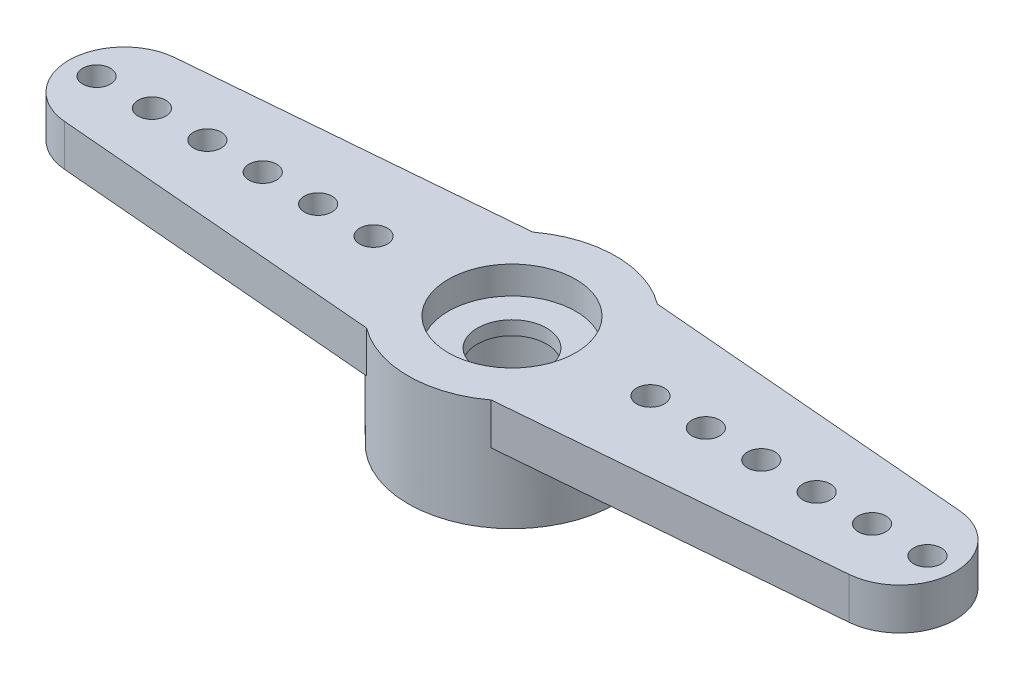
ISO-10303-21;
HEADER;
FILE_DESCRIPTION(('STEP AP214'),'2;1');
FILE_NAME('part.step','',(''),(''),'','','');
FILE_SCHEMA(('AUTOMOTIVE_DESIGN { 1 0 10303 214 1 1 1 1 }'));
ENDSEC;
DATA;
#1=APPLICATION_CONTEXT('core data for automotive mechanical design processes');
#2=APPLICATION_PROTOCOL_DEFINITION('international standard','automotive_design',2000,#1);
#3=PRODUCT_CONTEXT('',#1,'mechanical');
#4=PRODUCT('Part','Part','',(#3));
#5=PRODUCT_RELATED_PRODUCT_CATEGORY('part','',(#4));
#6=PRODUCT_DEFINITION_FORMATION('','',#4);
#7=PRODUCT_DEFINITION_CONTEXT('part definition',#1,'design');
#8=PRODUCT_DEFINITION('design','',#6,#7);
#9=PRODUCT_DEFINITION_SHAPE('','',#8);
#10=(LENGTH_UNIT() NAMED_UNIT(*) SI_UNIT(.MILLI.,.METRE.));
#11=(NAMED_UNIT(*) PLANE_ANGLE_UNIT() SI_UNIT($,.RADIAN.));
#12=(NAMED_UNIT(*) SI_UNIT($,.STERADIAN.) SOLID_ANGLE_UNIT());
#13=UNCERTAINTY_MEASURE_WITH_UNIT(LENGTH_MEASURE(1.E-05),#10,'distance_accuracy_value','');
#14=(GEOMETRIC_REPRESENTATION_CONTEXT(3) GLOBAL_UNCERTAINTY_ASSIGNED_CONTEXT((#13)) GLOBAL_UNIT_ASSIGNED_CONTEXT((#10,
#11,#12)) REPRESENTATION_CONTEXT('',''));
#15=CARTESIAN_POINT('',(0.,0.,0.));
#16=DIRECTION('',(0.,0.,1.));
#17=DIRECTION('',(1.,0.,0.));
#18=AXIS2_PLACEMENT_3D('',#15,#16,#17);
#19=CARTESIAN_POINT('',(0.,-1.5,0.));
#20=DIRECTION('',(0.,1.,0.));
#21=DIRECTION('',(0.,0.,1.));
#22=AXIS2_PLACEMENT_3D('',#19,#20,#21);
#23=CYLINDRICAL_SURFACE('',#22,1.25);
#24=CARTESIAN_POINT('',(0.,3.,0.));
#25=DIRECTION('',(0.,1.,0.));
#26=DIRECTION('',(0.,0.,1.));
#27=AXIS2_PLACEMENT_3D('',#24,#25,#26);
#28=CIRCLE('',#27,1.25);
#29=CARTESIAN_POINT('',(0.,3.,1.25));
#30=VERTEX_POINT('',#29);
#31=EDGE_CURVE('E510',#30,#30,#28,.T.);
#32=ORIENTED_EDGE('',*,*,#31,.T.);
#33=EDGE_LOOP('',(#32));
#34=FACE_BOUND('',#33,.T.);
#35=CARTESIAN_POINT('',(0.,2.5,0.));
#36=DIRECTION('',(0.,-1.,0.));
#37=DIRECTION('',(0.,0.,-1.));
#38=AXIS2_PLACEMENT_3D('',#35,#36,#37);
#39=CIRCLE('',#38,1.25);
#40=CARTESIAN_POINT('',(0.,2.5,-1.25));
#41=VERTEX_POINT('',#40);
#42=EDGE_CURVE('E36',#41,#41,#39,.F.);
#43=ORIENTED_EDGE('',*,*,#42,.F.);
#44=EDGE_LOOP('',(#43));
#45=FACE_BOUND('',#44,.T.);
#46=ADVANCED_FACE('F32',(#34,#45),#23,.F.);
#47=CARTESIAN_POINT('',(0.,4.,0.));
#48=DIRECTION('',(0.,-1.,0.));
#49=DIRECTION('',(0.,0.,-1.));
#50=AXIS2_PLACEMENT_3D('',#47,#48,#49);
#51=CYLINDRICAL_SURFACE('',#50,3.75);
#52=CARTESIAN_POINT('',(0.,4.,0.));
#53=DIRECTION('',(0.,1.,0.));
#54=DIRECTION('',(0.,0.,1.));
#55=AXIS2_PLACEMENT_3D('',#52,#53,#54);
#56=CIRCLE('',#55,3.75);
#57=CARTESIAN_POINT('',(2.25,4.,-3.));
#58=VERTEX_POINT('',#57);
#59=CARTESIAN_POINT('',(-2.25,4.,-3.));
#60=VERTEX_POINT('',#59);
#61=EDGE_CURVE('E41',#58,#60,#56,.T.);
#62=ORIENTED_EDGE('',*,*,#61,.F.);
#63=DIRECTION('',(0.,1.,0.));
#64=VECTOR('',#63,1.);
#65=CARTESIAN_POINT('',(2.25,2.5,-3.));
#66=LINE('',#65,#64);
#67=CARTESIAN_POINT('',(2.25,2.5,-3.));
#68=VERTEX_POINT('',#67);
#69=EDGE_CURVE('E124',#68,#58,#66,.T.);
#70=ORIENTED_EDGE('',*,*,#69,.F.);
#71=CARTESIAN_POINT('',(0.,2.5,0.));
#72=DIRECTION('',(0.,-1.,0.));
#73=DIRECTION('',(0.,0.,-1.));
#74=AXIS2_PLACEMENT_3D('',#71,#72,#73);
#75=CIRCLE('',#74,3.75);
#76=CARTESIAN_POINT('',(2.25,2.5,3.));
#77=VERTEX_POINT('',#76);
#78=EDGE_CURVE('E116',#68,#77,#75,.T.);
#79=ORIENTED_EDGE('',*,*,#78,.T.);
#80=DIRECTION('',(0.,1.,0.));
#81=VECTOR('',#80,1.);
#82=CARTESIAN_POINT('',(2.25,2.5,3.));
#83=LINE('',#82,#81);
#84=CARTESIAN_POINT('',(2.25,4.,3.));
#85=VERTEX_POINT('',#84);
#86=EDGE_CURVE('E100',#77,#85,#83,.T.);
#87=ORIENTED_EDGE('',*,*,#86,.T.);
#88=CARTESIAN_POINT('',(-2.25,4.,3.));
#89=VERTEX_POINT('',#88);
#90=EDGE_CURVE('E11',#89,#85,#56,.T.);
#91=ORIENTED_EDGE('',*,*,#90,.F.);
#92=DIRECTION('',(0.,1.,0.));
#93=VECTOR('',#92,1.);
#94=CARTESIAN_POINT('',(-2.25,2.5,3.));
#95=LINE('',#94,#93);
#96=CARTESIAN_POINT('',(-2.25,2.5,3.));
#97=VERTEX_POINT('',#96);
#98=EDGE_CURVE('E202',#97,#89,#95,.T.);
#99=ORIENTED_EDGE('',*,*,#98,.F.);
#100=CARTESIAN_POINT('',(0.,2.5,0.));
#101=DIRECTION('',(0.,-1.,0.));
#102=DIRECTION('',(0.,0.,1.));
#103=AXIS2_PLACEMENT_3D('',#100,#101,#102);
#104=CIRCLE('',#103,3.75);
#105=CARTESIAN_POINT('',(-2.25,2.5,-3.));
#106=VERTEX_POINT('',#105);
#107=EDGE_CURVE('E185',#97,#106,#104,.T.);
#108=ORIENTED_EDGE('',*,*,#107,.T.);
#109=DIRECTION('',(0.,1.,0.));
#110=VECTOR('',#109,1.);
#111=CARTESIAN_POINT('',(-2.25,2.5,-3.));
#112=LINE('',#111,#110);
#113=EDGE_CURVE('E199',#106,#60,#112,.T.);
#114=ORIENTED_EDGE('',*,*,#113,.T.);
#115=EDGE_LOOP('',(#62,#70,#79,#87,#91,#99,#108,#114));
#116=FACE_BOUND('',#115,.T.);
#117=CARTESIAN_POINT('',(0.,0.,0.));
#118=DIRECTION('',(0.,1.,0.));
#119=DIRECTION('',(0.,0.,1.));
#120=AXIS2_PLACEMENT_3D('',#117,#118,#119);
#121=CIRCLE('',#120,3.75);
#122=CARTESIAN_POINT('',(0.,0.,3.75));
#123=VERTEX_POINT('',#122);
#124=EDGE_CURVE('E208',#123,#123,#121,.T.);
#125=ORIENTED_EDGE('',*,*,#124,.T.);
#126=EDGE_LOOP('',(#125));
#127=FACE_BOUND('',#126,.T.);
#128=ADVANCED_FACE('F34',(#116,#127),#51,.T.);
#129=CARTESIAN_POINT('',(0.,4.,0.));
#130=DIRECTION('',(0.,1.,0.));
#131=DIRECTION('',(0.,0.,1.));
#132=AXIS2_PLACEMENT_3D('',#129,#130,#131);
#133=PLANE('',#132);
#134=CARTESIAN_POINT('',(0.,4.,0.));
#135=DIRECTION('',(0.,1.,0.));
#136=DIRECTION('',(0.,0.,1.));
#137=AXIS2_PLACEMENT_3D('',#134,#135,#136);
#138=CIRCLE('',#137,2.3);
#139=CARTESIAN_POINT('',(0.,4.,2.3));
#140=VERTEX_POINT('',#139);
#141=EDGE_CURVE('E198',#140,#140,#138,.T.);
#142=ORIENTED_EDGE('',*,*,#141,.F.);
#143=EDGE_LOOP('',(#142));
#144=FACE_BOUND('',#143,.T.);
#145=ORIENTED_EDGE('',*,*,#90,.T.);
#146=DIRECTION('',(0.996448898518601,0.,-0.0841997187707063));
#147=VECTOR('',#146,1.);
#148=CARTESIAN_POINT('',(14.1683994375414,4.,1.9928977970372));
#149=LINE('',#148,#147);
#150=CARTESIAN_POINT('',(14.1683994375414,4.,1.99289779703721));
#151=VERTEX_POINT('',#150);
#152=EDGE_CURVE('E105',#85,#151,#149,.T.);
#153=ORIENTED_EDGE('',*,*,#152,.T.);
#154=CARTESIAN_POINT('',(14.,4.,0.));
#155=DIRECTION('',(0.,1.,0.));
#156=DIRECTION('',(0.,0.,-1.));
#157=AXIS2_PLACEMENT_3D('',#154,#155,#156);
#158=CIRCLE('',#157,2.);
#159=CARTESIAN_POINT('',(14.1683994375414,4.,-1.9928977970372));
#160=VERTEX_POINT('',#159);
#161=EDGE_CURVE('E126',#151,#160,#158,.T.);
#162=ORIENTED_EDGE('',*,*,#161,.T.);
#163=DIRECTION('',(-0.996448898518601,0.,-0.0841997187707069));
#164=VECTOR('',#163,1.);
#165=CARTESIAN_POINT('',(14.1683994375414,4.,-1.9928977970372));
#166=LINE('',#165,#164);
#167=EDGE_CURVE('E49',#160,#58,#166,.T.);
#168=ORIENTED_EDGE('',*,*,#167,.T.);
#169=ORIENTED_EDGE('',*,*,#61,.T.);
#170=DIRECTION('',(-0.996448898518601,0.,0.0841997187707069));
#171=VECTOR('',#170,1.);
#172=CARTESIAN_POINT('',(-14.1683994375414,4.,-1.9928977970372));
#173=LINE('',#172,#171);
#174=CARTESIAN_POINT('',(-14.1683994375414,4.,-1.9928977970372));
#175=VERTEX_POINT('',#174);
#176=EDGE_CURVE('E182',#60,#175,#173,.T.);
#177=ORIENTED_EDGE('',*,*,#176,.T.);
#178=CARTESIAN_POINT('',(-14.,4.,0.));
#179=DIRECTION('',(0.,1.,0.));
#180=DIRECTION('',(0.,0.,1.));
#181=AXIS2_PLACEMENT_3D('',#178,#179,#180);
#182=CIRCLE('',#181,2.);
#183=CARTESIAN_POINT('',(-14.1683994375414,4.,1.9928977970372));
#184=VERTEX_POINT('',#183);
#185=EDGE_CURVE('E175',#175,#184,#182,.T.);
#186=ORIENTED_EDGE('',*,*,#185,.T.);
#187=DIRECTION('',(0.996448898518601,0.,0.0841997187707063));
#188=VECTOR('',#187,1.);
#189=CARTESIAN_POINT('',(-14.1683994375414,4.,1.9928977970372));
#190=LINE('',#189,#188);
#191=EDGE_CURVE('E55',#184,#89,#190,.T.);
#192=ORIENTED_EDGE('',*,*,#191,.T.);
#193=EDGE_LOOP('',(#145,#153,#162,#168,#169,#177,#186,#192));
#194=FACE_BOUND('',#193,.T.);
#195=CARTESIAN_POINT('',(-5.,4.,0.));
#196=DIRECTION('',(0.,1.,0.));
#197=DIRECTION('',(0.,0.,1.));
#198=AXIS2_PLACEMENT_3D('',#195,#196,#197);
#199=CIRCLE('',#198,0.500000000000001);
#200=CARTESIAN_POINT('',(-5.,4.,0.500000000000005));
#201=VERTEX_POINT('',#200);
#202=EDGE_CURVE('E138',#201,#201,#199,.T.);
#203=ORIENTED_EDGE('',*,*,#202,.F.);
#204=EDGE_LOOP('',(#203));
#205=FACE_BOUND('',#204,.T.);
#206=CARTESIAN_POINT('',(-7.,4.,0.));
#207=DIRECTION('',(0.,1.,0.));
#208=DIRECTION('',(0.,0.,1.));
#209=AXIS2_PLACEMENT_3D('',#206,#207,#208);
#210=CIRCLE('',#209,0.500000000000001);
#211=CARTESIAN_POINT('',(-7.,4.,0.500000000000005));
#212=VERTEX_POINT('',#211);
#213=EDGE_CURVE('E145',#212,#212,#210,.T.);
#214=ORIENTED_EDGE('',*,*,#213,.F.);
#215=EDGE_LOOP('',(#214));
#216=FACE_BOUND('',#215,.T.);
#217=CARTESIAN_POINT('',(-9.,4.,0.));
#218=DIRECTION('',(0.,1.,0.));
#219=DIRECTION('',(0.,0.,1.));
#220=AXIS2_PLACEMENT_3D('',#217,#218,#219);
#221=CIRCLE('',#220,0.500000000000001);
#222=CARTESIAN_POINT('',(-9.,4.,0.500000000000005));
#223=VERTEX_POINT('',#222);
#224=EDGE_CURVE('E151',#223,#223,#221,.T.);
#225=ORIENTED_EDGE('',*,*,#224,.F.);
#226=EDGE_LOOP('',(#225));
#227=FACE_BOUND('',#226,.T.);
#228=CARTESIAN_POINT('',(-11.,4.,0.));
#229=DIRECTION('',(0.,1.,0.));
#230=DIRECTION('',(0.,0.,1.));
#231=AXIS2_PLACEMENT_3D('',#228,#229,#230);
#232=CIRCLE('',#231,0.500000000000001);
#233=CARTESIAN_POINT('',(-11.,4.,0.500000000000005));
#234=VERTEX_POINT('',#233);
#235=EDGE_CURVE('E157',#234,#234,#232,.T.);
#236=ORIENTED_EDGE('',*,*,#235,.F.);
#237=EDGE_LOOP('',(#236));
#238=FACE_BOUND('',#237,.T.);
#239=CARTESIAN_POINT('',(-13.,4.,0.));
#240=DIRECTION('',(0.,1.,0.));
#241=DIRECTION('',(0.,0.,1.));
#242=AXIS2_PLACEMENT_3D('',#239,#240,#241);
#243=CIRCLE('',#242,0.500000000000001);
#244=CARTESIAN_POINT('',(-13.,4.,0.500000000000005));
#245=VERTEX_POINT('',#244);
#246=EDGE_CURVE('E163',#245,#245,#243,.T.);
#247=ORIENTED_EDGE('',*,*,#246,.F.);
#248=EDGE_LOOP('',(#247));
#249=FACE_BOUND('',#248,.T.);
#250=CARTESIAN_POINT('',(-15.,4.,0.));
#251=DIRECTION('',(0.,1.,0.));
#252=DIRECTION('',(0.,0.,1.));
#253=AXIS2_PLACEMENT_3D('',#250,#251,#252);
#254=CIRCLE('',#253,0.500000000000001);
#255=CARTESIAN_POINT('',(-15.,4.,0.500000000000005));
#256=VERTEX_POINT('',#255);
#257=EDGE_CURVE('E169',#256,#256,#254,.T.);
#258=ORIENTED_EDGE('',*,*,#257,.F.);
#259=EDGE_LOOP('',(#258));
#260=FACE_BOUND('',#259,.T.);
#261=CARTESIAN_POINT('',(13.,4.,0.));
#262=DIRECTION('',(0.,1.,0.));
#263=DIRECTION('',(0.,0.,-1.));
#264=AXIS2_PLACEMENT_3D('',#261,#262,#263);
#265=CIRCLE('',#264,0.500000000000001);
#266=CARTESIAN_POINT('',(13.,4.,-0.499999999999997));
#267=VERTEX_POINT('',#266);
#268=EDGE_CURVE('E512',#267,#267,#265,.T.);
#269=ORIENTED_EDGE('',*,*,#268,.F.);
#270=EDGE_LOOP('',(#269));
#271=FACE_BOUND('',#270,.T.);
#272=CARTESIAN_POINT('',(11.,4.,0.));
#273=DIRECTION('',(0.,1.,0.));
#274=DIRECTION('',(0.,0.,-1.));
#275=AXIS2_PLACEMENT_3D('',#272,#273,#274);
#276=CIRCLE('',#275,0.500000000000001);
#277=CARTESIAN_POINT('',(11.,4.,-0.499999999999997));
#278=VERTEX_POINT('',#277);
#279=EDGE_CURVE('E516',#278,#278,#276,.T.);
#280=ORIENTED_EDGE('',*,*,#279,.F.);
#281=EDGE_LOOP('',(#280));
#282=FACE_BOUND('',#281,.T.);
#283=CARTESIAN_POINT('',(9.,4.,0.));
#284=DIRECTION('',(0.,1.,0.));
#285=DIRECTION('',(0.,0.,-1.));
#286=AXIS2_PLACEMENT_3D('',#283,#284,#285);
#287=CIRCLE('',#286,0.500000000000001);
#288=CARTESIAN_POINT('',(9.,4.,-0.499999999999997));
#289=VERTEX_POINT('',#288);
#290=EDGE_CURVE('E522',#289,#289,#287,.T.);
#291=ORIENTED_EDGE('',*,*,#290,.F.);
#292=EDGE_LOOP('',(#291));
#293=FACE_BOUND('',#292,.T.);
#294=CARTESIAN_POINT('',(7.,4.,0.));
#295=DIRECTION('',(0.,1.,0.));
#296=DIRECTION('',(0.,0.,-1.));
#297=AXIS2_PLACEMENT_3D('',#294,#295,#296);
#298=CIRCLE('',#297,0.500000000000001);
#299=CARTESIAN_POINT('',(7.,4.,-0.499999999999997));
#300=VERTEX_POINT('',#299);
#301=EDGE_CURVE('E528',#300,#300,#298,.T.);
#302=ORIENTED_EDGE('',*,*,#301,.F.);
#303=EDGE_LOOP('',(#302));
#304=FACE_BOUND('',#303,.T.);
#305=CARTESIAN_POINT('',(5.,4.,0.));
#306=DIRECTION('',(0.,1.,0.));
#307=DIRECTION('',(0.,0.,-1.));
#308=AXIS2_PLACEMENT_3D('',#305,#306,#307);
#309=CIRCLE('',#308,0.500000000000001);
#310=CARTESIAN_POINT('',(5.,4.,-0.499999999999997));
#311=VERTEX_POINT('',#310);
#312=EDGE_CURVE('E534',#311,#311,#309,.T.);
#313=ORIENTED_EDGE('',*,*,#312,.F.);
#314=EDGE_LOOP('',(#313));
#315=FACE_BOUND('',#314,.T.);
#316=CARTESIAN_POINT('',(15.,4.,0.));
#317=DIRECTION('',(0.,1.,0.));
#318=DIRECTION('',(0.,0.,-1.));
#319=AXIS2_PLACEMENT_3D('',#316,#317,#318);
#320=CIRCLE('',#319,0.500000000000001);
#321=CARTESIAN_POINT('',(15.,4.,-0.499999999999997));
#322=VERTEX_POINT('',#321);
#323=EDGE_CURVE('E129',#322,#322,#320,.T.);
#324=ORIENTED_EDGE('',*,*,#323,.F.);
#325=EDGE_LOOP('',(#324));
#326=FACE_BOUND('',#325,.T.);
#327=ADVANCED_FACE('F213',(#144,#194,#205,#216,#227,#238,#249,#260,#271,#282,#293,#304,#315,
#326),#133,.T.);
#328=CARTESIAN_POINT('',(0.,0.,0.));
#329=DIRECTION('',(0.,1.,0.));
#330=DIRECTION('',(0.,0.,1.));
#331=AXIS2_PLACEMENT_3D('',#328,#329,#330);
#332=PLANE('',#331);
#333=CARTESIAN_POINT('',(0.,0.,0.));
#334=DIRECTION('',(0.,-1.,0.));
#335=DIRECTION('',(0.,0.,-1.));
#336=AXIS2_PLACEMENT_3D('',#333,#334,#335);
#337=CIRCLE('',#336,2.3);
#338=CARTESIAN_POINT('',(0.,0.,-2.3));
#339=VERTEX_POINT('',#338);
#340=EDGE_CURVE('E503',#339,#339,#337,.T.);
#341=ORIENTED_EDGE('',*,*,#340,.F.);
#342=EDGE_LOOP('',(#341));
#343=FACE_BOUND('',#342,.T.);
#344=ORIENTED_EDGE('',*,*,#124,.F.);
#345=EDGE_LOOP('',(#344));
#346=FACE_BOUND('',#345,.T.);
#347=ADVANCED_FACE('F463',(#343,#346),#332,.F.);
#348=CARTESIAN_POINT('',(0.,3.,0.));
#349=DIRECTION('',(0.,1.,0.));
#350=DIRECTION('',(0.,0.,1.));
#351=AXIS2_PLACEMENT_3D('',#348,#349,#350);
#352=CYLINDRICAL_SURFACE('',#351,2.3);
#353=CARTESIAN_POINT('',(0.,3.,0.));
#354=DIRECTION('',(0.,1.,0.));
#355=DIRECTION('',(0.,0.,1.));
#356=AXIS2_PLACEMENT_3D('',#353,#354,#355);
#357=CIRCLE('',#356,2.3);
#358=CARTESIAN_POINT('',(0.,3.,2.3));
#359=VERTEX_POINT('',#358);
#360=EDGE_CURVE('E205',#359,#359,#357,.T.);
#361=ORIENTED_EDGE('',*,*,#360,.F.);
#362=EDGE_LOOP('',(#361));
#363=FACE_BOUND('',#362,.T.);
#364=ORIENTED_EDGE('',*,*,#141,.T.);
#365=EDGE_LOOP('',(#364));
#366=FACE_BOUND('',#365,.T.);
#367=ADVANCED_FACE('F236',(#363,#366),#352,.F.);
#368=CARTESIAN_POINT('',(0.,3.,0.));
#369=DIRECTION('',(0.,1.,0.));
#370=DIRECTION('',(0.,0.,1.));
#371=AXIS2_PLACEMENT_3D('',#368,#369,#370);
#372=PLANE('',#371);
#373=ORIENTED_EDGE('',*,*,#31,.F.);
#374=EDGE_LOOP('',(#373));
#375=FACE_BOUND('',#374,.T.);
#376=ORIENTED_EDGE('',*,*,#360,.T.);
#377=EDGE_LOOP('',(#376));
#378=FACE_BOUND('',#377,.T.);
#379=ADVANCED_FACE('F229',(#375,#378),#372,.T.);
#380=CARTESIAN_POINT('',(-14.,2.5,0.));
#381=DIRECTION('',(0.,1.,0.));
#382=DIRECTION('',(0.,0.,1.));
#383=AXIS2_PLACEMENT_3D('',#380,#381,#382);
#384=CYLINDRICAL_SURFACE('',#383,2.);
#385=ORIENTED_EDGE('',*,*,#185,.F.);
#386=DIRECTION('',(0.,1.,0.));
#387=VECTOR('',#386,1.);
#388=CARTESIAN_POINT('',(-14.1683994375414,2.5,-1.9928977970372));
#389=LINE('',#388,#387);
#390=CARTESIAN_POINT('',(-14.1683994375414,2.5,-1.9928977970372));
#391=VERTEX_POINT('',#390);
#392=EDGE_CURVE('E196',#391,#175,#389,.T.);
#393=ORIENTED_EDGE('',*,*,#392,.F.);
#394=CARTESIAN_POINT('',(-14.,2.5,0.));
#395=DIRECTION('',(0.,1.,0.));
#396=DIRECTION('',(0.,0.,1.));
#397=AXIS2_PLACEMENT_3D('',#394,#395,#396);
#398=CIRCLE('',#397,2.);
#399=CARTESIAN_POINT('',(-14.1683994375414,2.5,1.9928977970372));
#400=VERTEX_POINT('',#399);
#401=EDGE_CURVE('E178',#391,#400,#398,.T.);
#402=ORIENTED_EDGE('',*,*,#401,.T.);
#403=DIRECTION('',(0.,1.,0.));
#404=VECTOR('',#403,1.);
#405=CARTESIAN_POINT('',(-14.1683994375414,2.5,1.9928977970372));
#406=LINE('',#405,#404);
#407=EDGE_CURVE('E191',#400,#184,#406,.T.);
#408=ORIENTED_EDGE('',*,*,#407,.T.);
#409=EDGE_LOOP('',(#385,#393,#402,#408));
#410=FACE_BOUND('',#409,.T.);
#411=ADVANCED_FACE('F227',(#410),#384,.T.);
#412=CARTESIAN_POINT('',(-14.1683994375414,2.5,-1.9928977970372));
#413=DIRECTION('',(-0.0841997187707069,0.,-0.996448898518601));
#414=DIRECTION('',(-0.996448898518601,0.,0.0841997187707069));
#415=AXIS2_PLACEMENT_3D('',#412,#413,#414);
#416=PLANE('',#415);
#417=ORIENTED_EDGE('',*,*,#176,.F.);
#418=ORIENTED_EDGE('',*,*,#113,.F.);
#419=DIRECTION('',(-0.996448898518601,0.,0.0841997187707069));
#420=VECTOR('',#419,1.);
#421=CARTESIAN_POINT('',(-14.1683994375414,2.5,-1.9928977970372));
#422=LINE('',#421,#420);
#423=EDGE_CURVE('E188',#106,#391,#422,.T.);
#424=ORIENTED_EDGE('',*,*,#423,.T.);
#425=ORIENTED_EDGE('',*,*,#392,.T.);
#426=EDGE_LOOP('',(#417,#418,#424,#425));
#427=FACE_BOUND('',#426,.T.);
#428=ADVANCED_FACE('F216',(#427),#416,.T.);
#429=CARTESIAN_POINT('',(-14.1683994375414,2.5,1.9928977970372));
#430=DIRECTION('',(-0.0841997187707063,0.,0.996448898518601));
#431=DIRECTION('',(0.996448898518601,0.,0.0841997187707063));
#432=AXIS2_PLACEMENT_3D('',#429,#430,#431);
#433=PLANE('',#432);
#434=ORIENTED_EDGE('',*,*,#191,.F.);
#435=ORIENTED_EDGE('',*,*,#407,.F.);
#436=DIRECTION('',(0.996448898518601,0.,0.0841997187707063));
#437=VECTOR('',#436,1.);
#438=CARTESIAN_POINT('',(-14.1683994375414,2.5,1.9928977970372));
#439=LINE('',#438,#437);
#440=EDGE_CURVE('E181',#400,#97,#439,.T.);
#441=ORIENTED_EDGE('',*,*,#440,.T.);
#442=ORIENTED_EDGE('',*,*,#98,.T.);
#443=EDGE_LOOP('',(#434,#435,#441,#442));
#444=FACE_BOUND('',#443,.T.);
#445=ADVANCED_FACE('F225',(#444),#433,.T.);
#446=CARTESIAN_POINT('',(-14.,2.5,0.));
#447=DIRECTION('',(0.,1.,0.));
#448=DIRECTION('',(0.,0.,1.));
#449=AXIS2_PLACEMENT_3D('',#446,#447,#448);
#450=PLANE('',#449);
#451=CARTESIAN_POINT('',(-5.,2.5,0.));
#452=DIRECTION('',(0.,1.,0.));
#453=DIRECTION('',(0.,0.,1.));
#454=AXIS2_PLACEMENT_3D('',#451,#452,#453);
#455=CIRCLE('',#454,0.500000000000001);
#456=CARTESIAN_POINT('',(-5.,2.5,0.500000000000005));
#457=VERTEX_POINT('',#456);
#458=EDGE_CURVE('E142',#457,#457,#455,.T.);
#459=ORIENTED_EDGE('',*,*,#458,.T.);
#460=EDGE_LOOP('',(#459));
#461=FACE_BOUND('',#460,.T.);
#462=CARTESIAN_POINT('',(-7.,2.5,0.));
#463=DIRECTION('',(0.,1.,0.));
#464=DIRECTION('',(0.,0.,1.));
#465=AXIS2_PLACEMENT_3D('',#462,#463,#464);
#466=CIRCLE('',#465,0.500000000000001);
#467=CARTESIAN_POINT('',(-7.,2.5,0.500000000000005));
#468=VERTEX_POINT('',#467);
#469=EDGE_CURVE('E148',#468,#468,#466,.T.);
#470=ORIENTED_EDGE('',*,*,#469,.T.);
#471=EDGE_LOOP('',(#470));
#472=FACE_BOUND('',#471,.T.);
#473=CARTESIAN_POINT('',(-9.,2.5,0.));
#474=DIRECTION('',(0.,1.,0.));
#475=DIRECTION('',(0.,0.,1.));
#476=AXIS2_PLACEMENT_3D('',#473,#474,#475);
#477=CIRCLE('',#476,0.500000000000001);
#478=CARTESIAN_POINT('',(-9.,2.5,0.500000000000005));
#479=VERTEX_POINT('',#478);
#480=EDGE_CURVE('E154',#479,#479,#477,.T.);
#481=ORIENTED_EDGE('',*,*,#480,.T.);
#482=EDGE_LOOP('',(#481));
#483=FACE_BOUND('',#482,.T.);
#484=CARTESIAN_POINT('',(-11.,2.5,0.));
#485=DIRECTION('',(0.,1.,0.));
#486=DIRECTION('',(0.,0.,1.));
#487=AXIS2_PLACEMENT_3D('',#484,#485,#486);
#488=CIRCLE('',#487,0.500000000000001);
#489=CARTESIAN_POINT('',(-11.,2.5,0.500000000000005));
#490=VERTEX_POINT('',#489);
#491=EDGE_CURVE('E160',#490,#490,#488,.T.);
#492=ORIENTED_EDGE('',*,*,#491,.T.);
#493=EDGE_LOOP('',(#492));
#494=FACE_BOUND('',#493,.T.);
#495=CARTESIAN_POINT('',(-13.,2.5,0.));
#496=DIRECTION('',(0.,1.,0.));
#497=DIRECTION('',(0.,0.,1.));
#498=AXIS2_PLACEMENT_3D('',#495,#496,#497);
#499=CIRCLE('',#498,0.500000000000001);
#500=CARTESIAN_POINT('',(-13.,2.5,0.500000000000005));
#501=VERTEX_POINT('',#500);
#502=EDGE_CURVE('E166',#501,#501,#499,.T.);
#503=ORIENTED_EDGE('',*,*,#502,.T.);
#504=EDGE_LOOP('',(#503));
#505=FACE_BOUND('',#504,.T.);
#506=CARTESIAN_POINT('',(-15.,2.5,0.));
#507=DIRECTION('',(0.,1.,0.));
#508=DIRECTION('',(0.,0.,1.));
#509=AXIS2_PLACEMENT_3D('',#506,#507,#508);
#510=CIRCLE('',#509,0.500000000000001);
#511=CARTESIAN_POINT('',(-15.,2.5,0.500000000000005));
#512=VERTEX_POINT('',#511);
#513=EDGE_CURVE('E172',#512,#512,#510,.T.);
#514=ORIENTED_EDGE('',*,*,#513,.T.);
#515=EDGE_LOOP('',(#514));
#516=FACE_BOUND('',#515,.T.);
#517=ORIENTED_EDGE('',*,*,#401,.F.);
#518=ORIENTED_EDGE('',*,*,#423,.F.);
#519=ORIENTED_EDGE('',*,*,#107,.F.);
#520=ORIENTED_EDGE('',*,*,#440,.F.);
#521=EDGE_LOOP('',(#517,#518,#519,#520));
#522=FACE_BOUND('',#521,.T.);
#523=ADVANCED_FACE('F223',(#461,#472,#483,#494,#505,#516,#522),#450,.F.);
#524=CARTESIAN_POINT('',(-15.,2.5,0.));
#525=DIRECTION('',(0.,1.,0.));
#526=DIRECTION('',(0.,0.,1.));
#527=AXIS2_PLACEMENT_3D('',#524,#525,#526);
#528=CYLINDRICAL_SURFACE('',#527,0.500000000000001);
#529=ORIENTED_EDGE('',*,*,#513,.F.);
#530=EDGE_LOOP('',(#529));
#531=FACE_BOUND('',#530,.T.);
#532=ORIENTED_EDGE('',*,*,#257,.T.);
#533=EDGE_LOOP('',(#532));
#534=FACE_BOUND('',#533,.T.);
#535=ADVANCED_FACE('F309',(#531,#534),#528,.F.);
#536=CARTESIAN_POINT('',(-13.,2.5,0.));
#537=DIRECTION('',(0.,1.,0.));
#538=DIRECTION('',(0.,0.,1.));
#539=AXIS2_PLACEMENT_3D('',#536,#537,#538);
#540=CYLINDRICAL_SURFACE('',#539,0.500000000000001);
#541=ORIENTED_EDGE('',*,*,#502,.F.);
#542=EDGE_LOOP('',(#541));
#543=FACE_BOUND('',#542,.T.);
#544=ORIENTED_EDGE('',*,*,#246,.T.);
#545=EDGE_LOOP('',(#544));
#546=FACE_BOUND('',#545,.T.);
#547=ADVANCED_FACE('F305',(#543,#546),#540,.F.);
#548=CARTESIAN_POINT('',(-11.,2.5,0.));
#549=DIRECTION('',(0.,1.,0.));
#550=DIRECTION('',(0.,0.,1.));
#551=AXIS2_PLACEMENT_3D('',#548,#549,#550);
#552=CYLINDRICAL_SURFACE('',#551,0.500000000000001);
#553=ORIENTED_EDGE('',*,*,#491,.F.);
#554=EDGE_LOOP('',(#553));
#555=FACE_BOUND('',#554,.T.);
#556=ORIENTED_EDGE('',*,*,#235,.T.);
#557=EDGE_LOOP('',(#556));
#558=FACE_BOUND('',#557,.T.);
#559=ADVANCED_FACE('F301',(#555,#558),#552,.F.);
#560=CARTESIAN_POINT('',(-9.,2.5,0.));
#561=DIRECTION('',(0.,1.,0.));
#562=DIRECTION('',(0.,0.,1.));
#563=AXIS2_PLACEMENT_3D('',#560,#561,#562);
#564=CYLINDRICAL_SURFACE('',#563,0.500000000000001);
#565=ORIENTED_EDGE('',*,*,#480,.F.);
#566=EDGE_LOOP('',(#565));
#567=FACE_BOUND('',#566,.T.);
#568=ORIENTED_EDGE('',*,*,#224,.T.);
#569=EDGE_LOOP('',(#568));
#570=FACE_BOUND('',#569,.T.);
#571=ADVANCED_FACE('F297',(#567,#570),#564,.F.);
#572=CARTESIAN_POINT('',(-7.,2.5,0.));
#573=DIRECTION('',(0.,1.,0.));
#574=DIRECTION('',(0.,0.,1.));
#575=AXIS2_PLACEMENT_3D('',#572,#573,#574);
#576=CYLINDRICAL_SURFACE('',#575,0.500000000000001);
#577=ORIENTED_EDGE('',*,*,#469,.F.);
#578=EDGE_LOOP('',(#577));
#579=FACE_BOUND('',#578,.T.);
#580=ORIENTED_EDGE('',*,*,#213,.T.);
#581=EDGE_LOOP('',(#580));
#582=FACE_BOUND('',#581,.T.);
#583=ADVANCED_FACE('F293',(#579,#582),#576,.F.);
#584=CARTESIAN_POINT('',(-5.,2.5,0.));
#585=DIRECTION('',(0.,1.,0.));
#586=DIRECTION('',(0.,0.,1.));
#587=AXIS2_PLACEMENT_3D('',#584,#585,#586);
#588=CYLINDRICAL_SURFACE('',#587,0.500000000000001);
#589=ORIENTED_EDGE('',*,*,#458,.F.);
#590=EDGE_LOOP('',(#589));
#591=FACE_BOUND('',#590,.T.);
#592=ORIENTED_EDGE('',*,*,#202,.T.);
#593=EDGE_LOOP('',(#592));
#594=FACE_BOUND('',#593,.T.);
#595=ADVANCED_FACE('F284',(#591,#594),#588,.F.);
#596=CARTESIAN_POINT('',(14.1683994375414,2.5,-1.9928977970372));
#597=DIRECTION('',(0.0841997187707069,0.,-0.996448898518601));
#598=DIRECTION('',(-0.996448898518601,0.,-0.0841997187707069));
#599=AXIS2_PLACEMENT_3D('',#596,#597,#598);
#600=PLANE('',#599);
#601=ORIENTED_EDGE('',*,*,#167,.F.);
#602=DIRECTION('',(0.,1.,0.));
#603=VECTOR('',#602,1.);
#604=CARTESIAN_POINT('',(14.1683994375414,2.5,-1.9928977970372));
#605=LINE('',#604,#603);
#606=CARTESIAN_POINT('',(14.1683994375414,2.5,-1.9928977970372));
#607=VERTEX_POINT('',#606);
#608=EDGE_CURVE('E139',#607,#160,#605,.T.);
#609=ORIENTED_EDGE('',*,*,#608,.F.);
#610=DIRECTION('',(-0.996448898518601,0.,-0.0841997187707069));
#611=VECTOR('',#610,1.);
#612=CARTESIAN_POINT('',(14.1683994375414,2.5,-1.9928977970372));
#613=LINE('',#612,#611);
#614=EDGE_CURVE('E110',#607,#68,#613,.T.);
#615=ORIENTED_EDGE('',*,*,#614,.T.);
#616=ORIENTED_EDGE('',*,*,#69,.T.);
#617=EDGE_LOOP('',(#601,#609,#615,#616));
#618=FACE_BOUND('',#617,.T.);
#619=ADVANCED_FACE('F280',(#618),#600,.T.);
#620=CARTESIAN_POINT('',(14.,2.5,0.));
#621=DIRECTION('',(0.,1.,0.));
#622=DIRECTION('',(0.,0.,1.));
#623=AXIS2_PLACEMENT_3D('',#620,#621,#622);
#624=CYLINDRICAL_SURFACE('',#623,2.);
#625=ORIENTED_EDGE('',*,*,#161,.F.);
#626=DIRECTION('',(0.,1.,0.));
#627=VECTOR('',#626,1.);
#628=CARTESIAN_POINT('',(14.1683994375414,2.5,1.99289779703721));
#629=LINE('',#628,#627);
#630=CARTESIAN_POINT('',(14.1683994375414,2.5,1.99289779703721));
#631=VERTEX_POINT('',#630);
#632=EDGE_CURVE('E109',#631,#151,#629,.T.);
#633=ORIENTED_EDGE('',*,*,#632,.F.);
#634=CARTESIAN_POINT('',(14.,2.5,0.));
#635=DIRECTION('',(0.,1.,0.));
#636=DIRECTION('',(0.,0.,-1.));
#637=AXIS2_PLACEMENT_3D('',#634,#635,#636);
#638=CIRCLE('',#637,2.);
#639=EDGE_CURVE('E119',#631,#607,#638,.T.);
#640=ORIENTED_EDGE('',*,*,#639,.T.);
#641=ORIENTED_EDGE('',*,*,#608,.T.);
#642=EDGE_LOOP('',(#625,#633,#640,#641));
#643=FACE_BOUND('',#642,.T.);
#644=ADVANCED_FACE('F283',(#643),#624,.T.);
#645=CARTESIAN_POINT('',(14.1683994375414,2.5,1.9928977970372));
#646=DIRECTION('',(0.0841997187707063,0.,0.996448898518601));
#647=DIRECTION('',(0.996448898518601,0.,-0.0841997187707063));
#648=AXIS2_PLACEMENT_3D('',#645,#646,#647);
#649=PLANE('',#648);
#650=ORIENTED_EDGE('',*,*,#152,.F.);
#651=ORIENTED_EDGE('',*,*,#86,.F.);
#652=DIRECTION('',(0.996448898518601,0.,-0.0841997187707063));
#653=VECTOR('',#652,1.);
#654=CARTESIAN_POINT('',(14.1683994375414,2.5,1.9928977970372));
#655=LINE('',#654,#653);
#656=EDGE_CURVE('E103',#77,#631,#655,.T.);
#657=ORIENTED_EDGE('',*,*,#656,.T.);
#658=ORIENTED_EDGE('',*,*,#632,.T.);
#659=EDGE_LOOP('',(#650,#651,#657,#658));
#660=FACE_BOUND('',#659,.T.);
#661=ADVANCED_FACE('F102',(#660),#649,.T.);
#662=CARTESIAN_POINT('',(0.,2.5,0.));
#663=DIRECTION('',(0.,-1.,0.));
#664=DIRECTION('',(0.,0.,-1.));
#665=AXIS2_PLACEMENT_3D('',#662,#663,#664);
#666=PLANE('',#665);
#667=CARTESIAN_POINT('',(13.,2.5,0.));
#668=DIRECTION('',(0.,1.,0.));
#669=DIRECTION('',(0.,0.,-1.));
#670=AXIS2_PLACEMENT_3D('',#667,#668,#669);
#671=CIRCLE('',#670,0.500000000000001);
#672=CARTESIAN_POINT('',(13.,2.5,-0.499999999999997));
#673=VERTEX_POINT('',#672);
#674=EDGE_CURVE('E513',#673,#673,#671,.T.);
#675=ORIENTED_EDGE('',*,*,#674,.T.);
#676=EDGE_LOOP('',(#675));
#677=FACE_BOUND('',#676,.T.);
#678=CARTESIAN_POINT('',(11.,2.5,0.));
#679=DIRECTION('',(0.,1.,0.));
#680=DIRECTION('',(0.,0.,-1.));
#681=AXIS2_PLACEMENT_3D('',#678,#679,#680);
#682=CIRCLE('',#681,0.500000000000001);
#683=CARTESIAN_POINT('',(11.,2.5,-0.499999999999997));
#684=VERTEX_POINT('',#683);
#685=EDGE_CURVE('E519',#684,#684,#682,.T.);
#686=ORIENTED_EDGE('',*,*,#685,.T.);
#687=EDGE_LOOP('',(#686));
#688=FACE_BOUND('',#687,.T.);
#689=CARTESIAN_POINT('',(9.,2.5,0.));
#690=DIRECTION('',(0.,1.,0.));
#691=DIRECTION('',(0.,0.,-1.));
#692=AXIS2_PLACEMENT_3D('',#689,#690,#691);
#693=CIRCLE('',#692,0.500000000000001);
#694=CARTESIAN_POINT('',(9.,2.5,-0.499999999999997));
#695=VERTEX_POINT('',#694);
#696=EDGE_CURVE('E525',#695,#695,#693,.T.);
#697=ORIENTED_EDGE('',*,*,#696,.T.);
#698=EDGE_LOOP('',(#697));
#699=FACE_BOUND('',#698,.T.);
#700=CARTESIAN_POINT('',(7.,2.5,0.));
#701=DIRECTION('',(0.,1.,0.));
#702=DIRECTION('',(0.,0.,-1.));
#703=AXIS2_PLACEMENT_3D('',#700,#701,#702);
#704=CIRCLE('',#703,0.500000000000001);
#705=CARTESIAN_POINT('',(7.,2.5,-0.499999999999997));
#706=VERTEX_POINT('',#705);
#707=EDGE_CURVE('E531',#706,#706,#704,.T.);
#708=ORIENTED_EDGE('',*,*,#707,.T.);
#709=EDGE_LOOP('',(#708));
#710=FACE_BOUND('',#709,.T.);
#711=CARTESIAN_POINT('',(5.,2.5,0.));
#712=DIRECTION('',(0.,1.,0.));
#713=DIRECTION('',(0.,0.,-1.));
#714=AXIS2_PLACEMENT_3D('',#711,#712,#713);
#715=CIRCLE('',#714,0.500000000000001);
#716=CARTESIAN_POINT('',(5.,2.5,-0.499999999999997));
#717=VERTEX_POINT('',#716);
#718=EDGE_CURVE('E537',#717,#717,#715,.T.);
#719=ORIENTED_EDGE('',*,*,#718,.T.);
#720=EDGE_LOOP('',(#719));
#721=FACE_BOUND('',#720,.T.);
#722=CARTESIAN_POINT('',(15.,2.5,0.));
#723=DIRECTION('',(0.,1.,0.));
#724=DIRECTION('',(0.,0.,-1.));
#725=AXIS2_PLACEMENT_3D('',#722,#723,#724);
#726=CIRCLE('',#725,0.500000000000001);
#727=CARTESIAN_POINT('',(15.,2.5,-0.499999999999997));
#728=VERTEX_POINT('',#727);
#729=EDGE_CURVE('E135',#728,#728,#726,.T.);
#730=ORIENTED_EDGE('',*,*,#729,.T.);
#731=EDGE_LOOP('',(#730));
#732=FACE_BOUND('',#731,.T.);
#733=ORIENTED_EDGE('',*,*,#78,.F.);
#734=ORIENTED_EDGE('',*,*,#614,.F.);
#735=ORIENTED_EDGE('',*,*,#639,.F.);
#736=ORIENTED_EDGE('',*,*,#656,.F.);
#737=EDGE_LOOP('',(#733,#734,#735,#736));
#738=FACE_BOUND('',#737,.T.);
#739=ADVANCED_FACE('F114',(#677,#688,#699,#710,#721,#732,#738),#666,.T.);
#740=CARTESIAN_POINT('',(15.,2.5,0.));
#741=DIRECTION('',(0.,1.,0.));
#742=DIRECTION('',(0.,0.,1.));
#743=AXIS2_PLACEMENT_3D('',#740,#741,#742);
#744=CYLINDRICAL_SURFACE('',#743,0.500000000000001);
#745=ORIENTED_EDGE('',*,*,#729,.F.);
#746=EDGE_LOOP('',(#745));
#747=FACE_BOUND('',#746,.T.);
#748=ORIENTED_EDGE('',*,*,#323,.T.);
#749=EDGE_LOOP('',(#748));
#750=FACE_BOUND('',#749,.T.);
#751=ADVANCED_FACE('F272',(#747,#750),#744,.F.);
#752=CARTESIAN_POINT('',(5.,2.5,0.));
#753=DIRECTION('',(0.,1.,0.));
#754=DIRECTION('',(0.,0.,1.));
#755=AXIS2_PLACEMENT_3D('',#752,#753,#754);
#756=CYLINDRICAL_SURFACE('',#755,0.500000000000001);
#757=ORIENTED_EDGE('',*,*,#718,.F.);
#758=EDGE_LOOP('',(#757));
#759=FACE_BOUND('',#758,.T.);
#760=ORIENTED_EDGE('',*,*,#312,.T.);
#761=EDGE_LOOP('',(#760));
#762=FACE_BOUND('',#761,.T.);
#763=ADVANCED_FACE('F268',(#759,#762),#756,.F.);
#764=CARTESIAN_POINT('',(7.,2.5,0.));
#765=DIRECTION('',(0.,1.,0.));
#766=DIRECTION('',(0.,0.,1.));
#767=AXIS2_PLACEMENT_3D('',#764,#765,#766);
#768=CYLINDRICAL_SURFACE('',#767,0.500000000000001);
#769=ORIENTED_EDGE('',*,*,#707,.F.);
#770=EDGE_LOOP('',(#769));
#771=FACE_BOUND('',#770,.T.);
#772=ORIENTED_EDGE('',*,*,#301,.T.);
#773=EDGE_LOOP('',(#772));
#774=FACE_BOUND('',#773,.T.);
#775=ADVANCED_FACE('F264',(#771,#774),#768,.F.);
#776=CARTESIAN_POINT('',(9.,2.5,0.));
#777=DIRECTION('',(0.,1.,0.));
#778=DIRECTION('',(0.,0.,1.));
#779=AXIS2_PLACEMENT_3D('',#776,#777,#778);
#780=CYLINDRICAL_SURFACE('',#779,0.500000000000001);
#781=ORIENTED_EDGE('',*,*,#696,.F.);
#782=EDGE_LOOP('',(#781));
#783=FACE_BOUND('',#782,.T.);
#784=ORIENTED_EDGE('',*,*,#290,.T.);
#785=EDGE_LOOP('',(#784));
#786=FACE_BOUND('',#785,.T.);
#787=ADVANCED_FACE('F260',(#783,#786),#780,.F.);
#788=CARTESIAN_POINT('',(11.,2.5,0.));
#789=DIRECTION('',(0.,1.,0.));
#790=DIRECTION('',(0.,0.,1.));
#791=AXIS2_PLACEMENT_3D('',#788,#789,#790);
#792=CYLINDRICAL_SURFACE('',#791,0.500000000000001);
#793=ORIENTED_EDGE('',*,*,#685,.F.);
#794=EDGE_LOOP('',(#793));
#795=FACE_BOUND('',#794,.T.);
#796=ORIENTED_EDGE('',*,*,#279,.T.);
#797=EDGE_LOOP('',(#796));
#798=FACE_BOUND('',#797,.T.);
#799=ADVANCED_FACE('F256',(#795,#798),#792,.F.);
#800=CARTESIAN_POINT('',(13.,2.5,0.));
#801=DIRECTION('',(0.,1.,0.));
#802=DIRECTION('',(0.,0.,1.));
#803=AXIS2_PLACEMENT_3D('',#800,#801,#802);
#804=CYLINDRICAL_SURFACE('',#803,0.500000000000001);
#805=ORIENTED_EDGE('',*,*,#674,.F.);
#806=EDGE_LOOP('',(#805));
#807=FACE_BOUND('',#806,.T.);
#808=ORIENTED_EDGE('',*,*,#268,.T.);
#809=EDGE_LOOP('',(#808));
#810=FACE_BOUND('',#809,.T.);
#811=ADVANCED_FACE('F252',(#807,#810),#804,.F.);
#812=CARTESIAN_POINT('',(0.,2.5,0.));
#813=DIRECTION('',(0.,-1.,0.));
#814=DIRECTION('',(0.,0.,-1.));
#815=AXIS2_PLACEMENT_3D('',#812,#813,#814);
#816=PLANE('',#815);
#817=CARTESIAN_POINT('',(0.,2.5,0.));
#818=DIRECTION('',(0.,-1.,0.));
#819=DIRECTION('',(0.,0.,-1.));
#820=AXIS2_PLACEMENT_3D('',#817,#818,#819);
#821=CIRCLE('',#820,2.3);
#822=CARTESIAN_POINT('',(0.,2.5,-2.3));
#823=VERTEX_POINT('',#822);
#824=EDGE_CURVE('E505',#823,#823,#821,.T.);
#825=ORIENTED_EDGE('',*,*,#824,.T.);
#826=EDGE_LOOP('',(#825));
#827=FACE_BOUND('',#826,.T.);
#828=ORIENTED_EDGE('',*,*,#42,.T.);
#829=EDGE_LOOP('',(#828));
#830=FACE_BOUND('',#829,.T.);
#831=ADVANCED_FACE('F255',(#827,#830),#816,.T.);
#832=CARTESIAN_POINT('',(0.,2.5,0.));
#833=DIRECTION('',(0.,-1.,0.));
#834=DIRECTION('',(0.,0.,-1.));
#835=AXIS2_PLACEMENT_3D('',#832,#833,#834);
#836=CYLINDRICAL_SURFACE('',#835,2.3);
#837=ORIENTED_EDGE('',*,*,#824,.F.);
#838=EDGE_LOOP('',(#837));
#839=FACE_BOUND('',#838,.T.);
#840=ORIENTED_EDGE('',*,*,#340,.T.);
#841=EDGE_LOOP('',(#840));
#842=FACE_BOUND('',#841,.T.);
#843=ADVANCED_FACE('F250',(#839,#842),#836,.F.);
#844=CLOSED_SHELL('',(#46,#128,#327,#347,#367,#379,#411,#428,#445,#523,#535,#547,#559,#571,#583,
#595,#619,#644,#661,#739,#751,#763,#775,#787,#799,#811,#831,#843));
#845=MANIFOLD_SOLID_BREP('B2',#844);
#846=ADVANCED_BREP_SHAPE_REPRESENTATION('',(#18,#845),#14);
#847=SHAPE_DEFINITION_REPRESENTATION(#9,#846);
ENDSEC;
END-ISO-10303-21;
